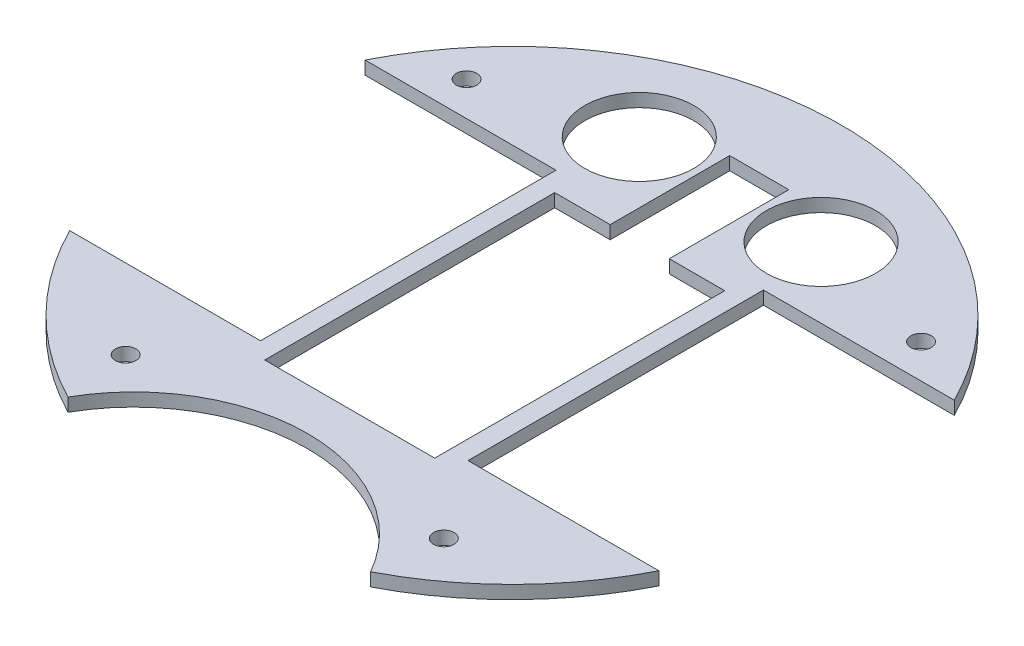
ISO-10303-21;
HEADER;
FILE_DESCRIPTION(('STEP AP214'),'2;1');
FILE_NAME('part.step','',(''),(''),'','','');
FILE_SCHEMA(('AUTOMOTIVE_DESIGN { 1 0 10303 214 1 1 1 1 }'));
ENDSEC;
DATA;
#1=APPLICATION_CONTEXT('core data for automotive mechanical design processes');
#2=APPLICATION_PROTOCOL_DEFINITION('international standard','automotive_design',2000,#1);
#3=PRODUCT_CONTEXT('',#1,'mechanical');
#4=PRODUCT('Part','Part','',(#3));
#5=PRODUCT_RELATED_PRODUCT_CATEGORY('part','',(#4));
#6=PRODUCT_DEFINITION_FORMATION('','',#4);
#7=PRODUCT_DEFINITION_CONTEXT('part definition',#1,'design');
#8=PRODUCT_DEFINITION('design','',#6,#7);
#9=PRODUCT_DEFINITION_SHAPE('','',#8);
#10=(LENGTH_UNIT() NAMED_UNIT(*) SI_UNIT(.MILLI.,.METRE.));
#11=(NAMED_UNIT(*) PLANE_ANGLE_UNIT() SI_UNIT($,.RADIAN.));
#12=(NAMED_UNIT(*) SI_UNIT($,.STERADIAN.) SOLID_ANGLE_UNIT());
#13=UNCERTAINTY_MEASURE_WITH_UNIT(LENGTH_MEASURE(1.E-05),#10,'distance_accuracy_value','');
#14=(GEOMETRIC_REPRESENTATION_CONTEXT(3) GLOBAL_UNCERTAINTY_ASSIGNED_CONTEXT((#13)) GLOBAL_UNIT_ASSIGNED_CONTEXT((#10,
#11,#12)) REPRESENTATION_CONTEXT('',''));
#15=CARTESIAN_POINT('',(0.,0.,0.));
#16=DIRECTION('',(0.,0.,1.));
#17=DIRECTION('',(1.,0.,0.));
#18=AXIS2_PLACEMENT_3D('',#15,#16,#17);
#19=CARTESIAN_POINT('',(18.7,0.,-28.1));
#20=DIRECTION('',(0.,0.,-1.));
#21=DIRECTION('',(-1.,0.,0.));
#22=AXIS2_PLACEMENT_3D('',#19,#20,#21);
#23=PLANE('',#22);
#24=DIRECTION('',(-1.,0.,0.));
#25=VECTOR('',#24,1.);
#26=CARTESIAN_POINT('',(18.7,0.,-28.1));
#27=LINE('',#26,#25);
#28=CARTESIAN_POINT('',(-6.5,0.,-28.1));
#29=VERTEX_POINT('',#28);
#30=CARTESIAN_POINT('',(-18.7,0.,-28.1));
#31=VERTEX_POINT('',#30);
#32=EDGE_CURVE('E174',#29,#31,#27,.T.);
#33=ORIENTED_EDGE('',*,*,#32,.F.);
#34=DIRECTION('',(0.,1.,0.));
#35=VECTOR('',#34,1.);
#36=CARTESIAN_POINT('',(-6.5,0.,-28.1));
#37=LINE('',#36,#35);
#38=CARTESIAN_POINT('',(-6.5,2.9,-28.1));
#39=VERTEX_POINT('',#38);
#40=EDGE_CURVE('E157',#29,#39,#37,.T.);
#41=ORIENTED_EDGE('',*,*,#40,.T.);
#42=DIRECTION('',(-1.,0.,0.));
#43=VECTOR('',#42,1.);
#44=CARTESIAN_POINT('',(18.7,2.9,-28.1));
#45=LINE('',#44,#43);
#46=CARTESIAN_POINT('',(-18.7,2.9,-28.1));
#47=VERTEX_POINT('',#46);
#48=EDGE_CURVE('E201',#39,#47,#45,.T.);
#49=ORIENTED_EDGE('',*,*,#48,.T.);
#50=DIRECTION('',(0.,1.,0.));
#51=VECTOR('',#50,1.);
#52=CARTESIAN_POINT('',(-18.7,0.,-28.1));
#53=LINE('',#52,#51);
#54=EDGE_CURVE('E180',#31,#47,#53,.T.);
#55=ORIENTED_EDGE('',*,*,#54,.F.);
#56=EDGE_LOOP('',(#33,#41,#49,#55));
#57=FACE_BOUND('',#56,.T.);
#58=ADVANCED_FACE('F32',(#57),#23,.F.);
#59=CARTESIAN_POINT('',(0.,2.9,0.));
#60=DIRECTION('',(0.,-1.,0.));
#61=DIRECTION('',(0.,0.,-1.));
#62=AXIS2_PLACEMENT_3D('',#59,#60,#61);
#63=CYLINDRICAL_SURFACE('',#62,72.5);
#64=CARTESIAN_POINT('',(0.,0.,0.));
#65=DIRECTION('',(0.,1.,0.));
#66=DIRECTION('',(0.,0.,1.));
#67=AXIS2_PLACEMENT_3D('',#64,#65,#66);
#68=CIRCLE('',#67,72.5);
#69=CARTESIAN_POINT('',(33.2911053697012,0.,64.4045984636458));
#70=VERTEX_POINT('',#69);
#71=CARTESIAN_POINT('',(64.8074069840786,0.,32.4999999999999));
#72=VERTEX_POINT('',#71);
#73=EDGE_CURVE('E218',#70,#72,#68,.T.);
#74=ORIENTED_EDGE('',*,*,#73,.T.);
#75=DIRECTION('',(0.,1.,0.));
#76=VECTOR('',#75,1.);
#77=CARTESIAN_POINT('',(64.8074069840786,0.,32.4999999999999));
#78=LINE('',#77,#76);
#79=CARTESIAN_POINT('',(64.8074069840786,2.9,32.4999999999999));
#80=VERTEX_POINT('',#79);
#81=EDGE_CURVE('E244',#72,#80,#78,.T.);
#82=ORIENTED_EDGE('',*,*,#81,.T.);
#83=CARTESIAN_POINT('',(0.,2.9,0.));
#84=DIRECTION('',(0.,1.,0.));
#85=DIRECTION('',(0.,0.,1.));
#86=AXIS2_PLACEMENT_3D('',#83,#84,#85);
#87=CIRCLE('',#86,72.5);
#88=CARTESIAN_POINT('',(33.2911053697012,2.9,64.4045984636458));
#89=VERTEX_POINT('',#88);
#90=EDGE_CURVE('E219',#89,#80,#87,.T.);
#91=ORIENTED_EDGE('',*,*,#90,.F.);
#92=DIRECTION('',(0.,-1.,0.));
#93=VECTOR('',#92,1.);
#94=CARTESIAN_POINT('',(33.2911053697012,2.9,64.4045984636458));
#95=LINE('',#94,#93);
#96=EDGE_CURVE('E11',#89,#70,#95,.T.);
#97=ORIENTED_EDGE('',*,*,#96,.T.);
#98=EDGE_LOOP('',(#74,#82,#91,#97));
#99=FACE_BOUND('',#98,.T.);
#100=ADVANCED_FACE('F243',(#99),#63,.T.);
#101=CARTESIAN_POINT('',(64.8074069840786,2.9,-32.5));
#102=VERTEX_POINT('',#101);
#103=CARTESIAN_POINT('',(-64.8074069840786,2.9,-32.5));
#104=VERTEX_POINT('',#103);
#105=EDGE_CURVE('E222',#102,#104,#87,.T.);
#106=ORIENTED_EDGE('',*,*,#105,.F.);
#107=DIRECTION('',(0.,1.,0.));
#108=VECTOR('',#107,1.);
#109=CARTESIAN_POINT('',(64.8074069840786,0.,-32.5));
#110=LINE('',#109,#108);
#111=CARTESIAN_POINT('',(64.8074069840786,0.,-32.5));
#112=VERTEX_POINT('',#111);
#113=EDGE_CURVE('E319',#112,#102,#110,.T.);
#114=ORIENTED_EDGE('',*,*,#113,.F.);
#115=CARTESIAN_POINT('',(-64.8074069840786,0.,-32.5));
#116=VERTEX_POINT('',#115);
#117=EDGE_CURVE('E227',#112,#116,#68,.T.);
#118=ORIENTED_EDGE('',*,*,#117,.T.);
#119=DIRECTION('',(0.,1.,0.));
#120=VECTOR('',#119,1.);
#121=CARTESIAN_POINT('',(-64.8074069840786,0.,-32.5));
#122=LINE('',#121,#120);
#123=EDGE_CURVE('E268',#116,#104,#122,.T.);
#124=ORIENTED_EDGE('',*,*,#123,.T.);
#125=EDGE_LOOP('',(#106,#114,#118,#124));
#126=FACE_BOUND('',#125,.T.);
#127=ADVANCED_FACE('F275',(#126),#63,.T.);
#128=CARTESIAN_POINT('',(0.,2.9,83.2397996376034));
#129=DIRECTION('',(0.,-1.,0.));
#130=DIRECTION('',(0.,0.,-1.));
#131=AXIS2_PLACEMENT_3D('',#128,#129,#130);
#132=CYLINDRICAL_SURFACE('',#131,38.25);
#133=CARTESIAN_POINT('',(0.,0.,83.2397996376034));
#134=DIRECTION('',(0.,-1.,0.));
#135=DIRECTION('',(0.,0.,1.));
#136=AXIS2_PLACEMENT_3D('',#133,#134,#135);
#137=CIRCLE('',#136,38.25);
#138=CARTESIAN_POINT('',(-33.2911053697012,0.,64.4045984636458));
#139=VERTEX_POINT('',#138);
#140=EDGE_CURVE('E207',#139,#70,#137,.T.);
#141=ORIENTED_EDGE('',*,*,#140,.T.);
#142=ORIENTED_EDGE('',*,*,#96,.F.);
#143=CARTESIAN_POINT('',(0.,2.9,83.2397996376034));
#144=DIRECTION('',(0.,-1.,0.));
#145=DIRECTION('',(0.,0.,1.));
#146=AXIS2_PLACEMENT_3D('',#143,#144,#145);
#147=CIRCLE('',#146,38.25);
#148=CARTESIAN_POINT('',(-33.2911053697012,2.9,64.4045984636458));
#149=VERTEX_POINT('',#148);
#150=EDGE_CURVE('E214',#149,#89,#147,.T.);
#151=ORIENTED_EDGE('',*,*,#150,.F.);
#152=DIRECTION('',(0.,-1.,0.));
#153=VECTOR('',#152,1.);
#154=CARTESIAN_POINT('',(-33.2911053697012,2.9,64.4045984636458));
#155=LINE('',#154,#153);
#156=EDGE_CURVE('E40',#149,#139,#155,.T.);
#157=ORIENTED_EDGE('',*,*,#156,.T.);
#158=EDGE_LOOP('',(#141,#142,#151,#157));
#159=FACE_BOUND('',#158,.T.);
#160=ADVANCED_FACE('F34',(#159),#132,.F.);
#161=CARTESIAN_POINT('',(-64.8074069840787,2.9,32.4999999999999));
#162=VERTEX_POINT('',#161);
#163=EDGE_CURVE('E217',#162,#149,#87,.T.);
#164=ORIENTED_EDGE('',*,*,#163,.F.);
#165=DIRECTION('',(0.,1.,0.));
#166=VECTOR('',#165,1.);
#167=CARTESIAN_POINT('',(-64.8074069840787,0.,32.4999999999999));
#168=LINE('',#167,#166);
#169=CARTESIAN_POINT('',(-64.8074069840787,0.,32.4999999999999));
#170=VERTEX_POINT('',#169);
#171=EDGE_CURVE('E195',#170,#162,#168,.T.);
#172=ORIENTED_EDGE('',*,*,#171,.F.);
#173=EDGE_CURVE('E225',#170,#139,#68,.T.);
#174=ORIENTED_EDGE('',*,*,#173,.T.);
#175=ORIENTED_EDGE('',*,*,#156,.F.);
#176=EDGE_LOOP('',(#164,#172,#174,#175));
#177=FACE_BOUND('',#176,.T.);
#178=ADVANCED_FACE('F342',(#177),#63,.T.);
#179=CARTESIAN_POINT('',(0.,2.9,41.6198998188017));
#180=DIRECTION('',(0.,1.,0.));
#181=DIRECTION('',(0.,0.,1.));
#182=AXIS2_PLACEMENT_3D('',#179,#180,#181);
#183=PLANE('',#182);
#184=CARTESIAN_POINT('',(-35.,2.9,50.));
#185=DIRECTION('',(0.,1.,0.));
#186=DIRECTION('',(0.,0.,1.));
#187=AXIS2_PLACEMENT_3D('',#184,#185,#186);
#188=CIRCLE('',#187,2.25);
#189=CARTESIAN_POINT('',(-35.,2.9,52.25));
#190=VERTEX_POINT('',#189);
#191=EDGE_CURVE('E436',#190,#190,#188,.T.);
#192=ORIENTED_EDGE('',*,*,#191,.F.);
#193=EDGE_LOOP('',(#192));
#194=FACE_BOUND('',#193,.T.);
#195=CARTESIAN_POINT('',(-50.,2.9,-40.));
#196=DIRECTION('',(0.,1.,0.));
#197=DIRECTION('',(0.,0.,1.));
#198=AXIS2_PLACEMENT_3D('',#195,#196,#197);
#199=CIRCLE('',#198,2.25);
#200=CARTESIAN_POINT('',(-50.,2.9,-37.75));
#201=VERTEX_POINT('',#200);
#202=EDGE_CURVE('E442',#201,#201,#199,.T.);
#203=ORIENTED_EDGE('',*,*,#202,.F.);
#204=EDGE_LOOP('',(#203));
#205=FACE_BOUND('',#204,.T.);
#206=CARTESIAN_POINT('',(50.,2.9,-40.));
#207=DIRECTION('',(0.,1.,0.));
#208=DIRECTION('',(0.,0.,1.));
#209=AXIS2_PLACEMENT_3D('',#206,#207,#208);
#210=CIRCLE('',#209,2.25);
#211=CARTESIAN_POINT('',(50.,2.9,-37.75));
#212=VERTEX_POINT('',#211);
#213=EDGE_CURVE('E450',#212,#212,#210,.T.);
#214=ORIENTED_EDGE('',*,*,#213,.F.);
#215=EDGE_LOOP('',(#214));
#216=FACE_BOUND('',#215,.T.);
#217=CARTESIAN_POINT('',(35.,2.9,50.));
#218=DIRECTION('',(0.,1.,0.));
#219=DIRECTION('',(0.,0.,1.));
#220=AXIS2_PLACEMENT_3D('',#217,#218,#219);
#221=CIRCLE('',#220,2.25);
#222=CARTESIAN_POINT('',(35.,2.9,52.25));
#223=VERTEX_POINT('',#222);
#224=EDGE_CURVE('E439',#223,#223,#221,.T.);
#225=ORIENTED_EDGE('',*,*,#224,.F.);
#226=EDGE_LOOP('',(#225));
#227=FACE_BOUND('',#226,.T.);
#228=CARTESIAN_POINT('',(20.,2.9,-48.));
#229=DIRECTION('',(0.,1.,0.));
#230=DIRECTION('',(0.,0.,1.));
#231=AXIS2_PLACEMENT_3D('',#228,#229,#230);
#232=CIRCLE('',#231,12.);
#233=CARTESIAN_POINT('',(20.,2.9,-36.));
#234=VERTEX_POINT('',#233);
#235=EDGE_CURVE('E456',#234,#234,#232,.T.);
#236=ORIENTED_EDGE('',*,*,#235,.F.);
#237=EDGE_LOOP('',(#236));
#238=FACE_BOUND('',#237,.T.);
#239=CARTESIAN_POINT('',(-20.,2.9,-48.));
#240=DIRECTION('',(0.,1.,0.));
#241=DIRECTION('',(0.,0.,1.));
#242=AXIS2_PLACEMENT_3D('',#239,#240,#241);
#243=CIRCLE('',#242,12.);
#244=CARTESIAN_POINT('',(-20.,2.9,-36.));
#245=VERTEX_POINT('',#244);
#246=EDGE_CURVE('E462',#245,#245,#243,.T.);
#247=ORIENTED_EDGE('',*,*,#246,.F.);
#248=EDGE_LOOP('',(#247));
#249=FACE_BOUND('',#248,.T.);
#250=DIRECTION('',(0.,0.,1.));
#251=VECTOR('',#250,1.);
#252=CARTESIAN_POINT('',(-6.5,2.9,-28.1));
#253=LINE('',#252,#251);
#254=CARTESIAN_POINT('',(-6.5,2.9,-54.4));
#255=VERTEX_POINT('',#254);
#256=EDGE_CURVE('E163',#255,#39,#253,.T.);
#257=ORIENTED_EDGE('',*,*,#256,.F.);
#258=DIRECTION('',(-1.,0.,0.));
#259=VECTOR('',#258,1.);
#260=CARTESIAN_POINT('',(6.5,2.9,-54.4));
#261=LINE('',#260,#259);
#262=CARTESIAN_POINT('',(6.5,2.9,-54.4));
#263=VERTEX_POINT('',#262);
#264=EDGE_CURVE('E177',#263,#255,#261,.T.);
#265=ORIENTED_EDGE('',*,*,#264,.F.);
#266=DIRECTION('',(0.,0.,-1.));
#267=VECTOR('',#266,1.);
#268=CARTESIAN_POINT('',(6.5,2.9,-28.1));
#269=LINE('',#268,#267);
#270=CARTESIAN_POINT('',(6.5,2.9,-28.1));
#271=VERTEX_POINT('',#270);
#272=EDGE_CURVE('E302',#271,#263,#269,.T.);
#273=ORIENTED_EDGE('',*,*,#272,.F.);
#274=CARTESIAN_POINT('',(18.7,2.9,-28.1));
#275=VERTEX_POINT('',#274);
#276=EDGE_CURVE('E202',#275,#271,#45,.T.);
#277=ORIENTED_EDGE('',*,*,#276,.F.);
#278=DIRECTION('',(0.,0.,-1.));
#279=VECTOR('',#278,1.);
#280=CARTESIAN_POINT('',(18.7,2.9,35.7));
#281=LINE('',#280,#279);
#282=CARTESIAN_POINT('',(18.7,2.9,35.7));
#283=VERTEX_POINT('',#282);
#284=EDGE_CURVE('E198',#283,#275,#281,.T.);
#285=ORIENTED_EDGE('',*,*,#284,.F.);
#286=DIRECTION('',(1.,0.,0.));
#287=VECTOR('',#286,1.);
#288=CARTESIAN_POINT('',(-18.7,2.9,35.7));
#289=LINE('',#288,#287);
#290=CARTESIAN_POINT('',(-18.7,2.9,35.7));
#291=VERTEX_POINT('',#290);
#292=EDGE_CURVE('E194',#291,#283,#289,.T.);
#293=ORIENTED_EDGE('',*,*,#292,.F.);
#294=DIRECTION('',(0.,0.,1.));
#295=VECTOR('',#294,1.);
#296=CARTESIAN_POINT('',(-18.7,2.9,-28.1));
#297=LINE('',#296,#295);
#298=EDGE_CURVE('E192',#47,#291,#297,.T.);
#299=ORIENTED_EDGE('',*,*,#298,.F.);
#300=ORIENTED_EDGE('',*,*,#48,.F.);
#301=EDGE_LOOP('',(#257,#265,#273,#277,#285,#293,#299,#300));
#302=FACE_BOUND('',#301,.T.);
#303=DIRECTION('',(1.,0.,0.));
#304=VECTOR('',#303,1.);
#305=CARTESIAN_POINT('',(34.6299999999999,2.9,32.5));
#306=LINE('',#305,#304);
#307=CARTESIAN_POINT('',(22.8299999999999,2.9,32.4999999999999));
#308=VERTEX_POINT('',#307);
#309=EDGE_CURVE('E316',#308,#80,#306,.T.);
#310=ORIENTED_EDGE('',*,*,#309,.F.);
#311=DIRECTION('',(0.,0.,1.));
#312=VECTOR('',#311,1.);
#313=CARTESIAN_POINT('',(22.8299999999999,2.9,-32.5));
#314=LINE('',#313,#312);
#315=CARTESIAN_POINT('',(22.8299999999999,2.9,-32.5));
#316=VERTEX_POINT('',#315);
#317=EDGE_CURVE('E321',#316,#308,#314,.T.);
#318=ORIENTED_EDGE('',*,*,#317,.F.);
#319=DIRECTION('',(-1.,0.,0.));
#320=VECTOR('',#319,1.);
#321=CARTESIAN_POINT('',(64.8074069840786,2.9,-32.5));
#322=LINE('',#321,#320);
#323=EDGE_CURVE('E260',#102,#316,#322,.T.);
#324=ORIENTED_EDGE('',*,*,#323,.F.);
#325=ORIENTED_EDGE('',*,*,#105,.T.);
#326=DIRECTION('',(-1.,0.,0.));
#327=VECTOR('',#326,1.);
#328=CARTESIAN_POINT('',(-22.8299999999999,2.9,-32.5));
#329=LINE('',#328,#327);
#330=CARTESIAN_POINT('',(-22.8299999999999,2.9,-32.5));
#331=VERTEX_POINT('',#330);
#332=EDGE_CURVE('E257',#331,#104,#329,.T.);
#333=ORIENTED_EDGE('',*,*,#332,.F.);
#334=DIRECTION('',(0.,0.,-1.));
#335=VECTOR('',#334,1.);
#336=CARTESIAN_POINT('',(-22.8299999999999,2.9,32.4999999999999));
#337=LINE('',#336,#335);
#338=CARTESIAN_POINT('',(-22.8299999999999,2.9,32.4999999999999));
#339=VERTEX_POINT('',#338);
#340=EDGE_CURVE('E273',#339,#331,#337,.T.);
#341=ORIENTED_EDGE('',*,*,#340,.F.);
#342=DIRECTION('',(1.,0.,0.));
#343=VECTOR('',#342,1.);
#344=CARTESIAN_POINT('',(-34.6299999999999,2.9,32.5));
#345=LINE('',#344,#343);
#346=EDGE_CURVE('E251',#162,#339,#345,.T.);
#347=ORIENTED_EDGE('',*,*,#346,.F.);
#348=ORIENTED_EDGE('',*,*,#163,.T.);
#349=ORIENTED_EDGE('',*,*,#150,.T.);
#350=ORIENTED_EDGE('',*,*,#90,.T.);
#351=EDGE_LOOP('',(#310,#318,#324,#325,#333,#341,#347,#348,#349,#350));
#352=FACE_BOUND('',#351,.T.);
#353=ADVANCED_FACE('F247',(#194,#205,#216,#227,#238,#249,#302,#352),#183,.T.);
#354=CARTESIAN_POINT('',(0.,0.,41.6198998188017));
#355=DIRECTION('',(0.,1.,0.));
#356=DIRECTION('',(0.,0.,1.));
#357=AXIS2_PLACEMENT_3D('',#354,#355,#356);
#358=PLANE('',#357);
#359=CARTESIAN_POINT('',(-35.,0.,50.));
#360=DIRECTION('',(0.,1.,0.));
#361=DIRECTION('',(0.,0.,1.));
#362=AXIS2_PLACEMENT_3D('',#359,#360,#361);
#363=CIRCLE('',#362,2.25);
#364=CARTESIAN_POINT('',(-35.,0.,52.25));
#365=VERTEX_POINT('',#364);
#366=EDGE_CURVE('E433',#365,#365,#363,.T.);
#367=ORIENTED_EDGE('',*,*,#366,.T.);
#368=EDGE_LOOP('',(#367));
#369=FACE_BOUND('',#368,.T.);
#370=CARTESIAN_POINT('',(-50.,0.,-40.));
#371=DIRECTION('',(0.,1.,0.));
#372=DIRECTION('',(0.,0.,1.));
#373=AXIS2_PLACEMENT_3D('',#370,#371,#372);
#374=CIRCLE('',#373,2.25);
#375=CARTESIAN_POINT('',(-50.,0.,-37.75));
#376=VERTEX_POINT('',#375);
#377=EDGE_CURVE('E437',#376,#376,#374,.T.);
#378=ORIENTED_EDGE('',*,*,#377,.T.);
#379=EDGE_LOOP('',(#378));
#380=FACE_BOUND('',#379,.T.);
#381=CARTESIAN_POINT('',(50.,0.,-40.));
#382=DIRECTION('',(0.,1.,0.));
#383=DIRECTION('',(0.,0.,1.));
#384=AXIS2_PLACEMENT_3D('',#381,#382,#383);
#385=CIRCLE('',#384,2.25);
#386=CARTESIAN_POINT('',(50.,0.,-37.75));
#387=VERTEX_POINT('',#386);
#388=EDGE_CURVE('E447',#387,#387,#385,.T.);
#389=ORIENTED_EDGE('',*,*,#388,.T.);
#390=EDGE_LOOP('',(#389));
#391=FACE_BOUND('',#390,.T.);
#392=CARTESIAN_POINT('',(35.,0.,50.));
#393=DIRECTION('',(0.,1.,0.));
#394=DIRECTION('',(0.,0.,1.));
#395=AXIS2_PLACEMENT_3D('',#392,#393,#394);
#396=CIRCLE('',#395,2.25);
#397=CARTESIAN_POINT('',(35.,0.,52.25));
#398=VERTEX_POINT('',#397);
#399=EDGE_CURVE('E453',#398,#398,#396,.T.);
#400=ORIENTED_EDGE('',*,*,#399,.T.);
#401=EDGE_LOOP('',(#400));
#402=FACE_BOUND('',#401,.T.);
#403=CARTESIAN_POINT('',(20.,0.,-48.));
#404=DIRECTION('',(0.,1.,0.));
#405=DIRECTION('',(0.,0.,1.));
#406=AXIS2_PLACEMENT_3D('',#403,#404,#405);
#407=CIRCLE('',#406,12.);
#408=CARTESIAN_POINT('',(20.,0.,-36.));
#409=VERTEX_POINT('',#408);
#410=EDGE_CURVE('E459',#409,#409,#407,.T.);
#411=ORIENTED_EDGE('',*,*,#410,.T.);
#412=EDGE_LOOP('',(#411));
#413=FACE_BOUND('',#412,.T.);
#414=CARTESIAN_POINT('',(-20.,0.,-48.));
#415=DIRECTION('',(0.,1.,0.));
#416=DIRECTION('',(0.,0.,1.));
#417=AXIS2_PLACEMENT_3D('',#414,#415,#416);
#418=CIRCLE('',#417,12.);
#419=CARTESIAN_POINT('',(-20.,0.,-36.));
#420=VERTEX_POINT('',#419);
#421=EDGE_CURVE('E303',#420,#420,#418,.T.);
#422=ORIENTED_EDGE('',*,*,#421,.T.);
#423=EDGE_LOOP('',(#422));
#424=FACE_BOUND('',#423,.T.);
#425=DIRECTION('',(-1.,0.,0.));
#426=VECTOR('',#425,1.);
#427=CARTESIAN_POINT('',(6.5,0.,-54.4));
#428=LINE('',#427,#426);
#429=CARTESIAN_POINT('',(6.5,0.,-54.4));
#430=VERTEX_POINT('',#429);
#431=CARTESIAN_POINT('',(-6.5,0.,-54.4));
#432=VERTEX_POINT('',#431);
#433=EDGE_CURVE('E168',#430,#432,#428,.T.);
#434=ORIENTED_EDGE('',*,*,#433,.T.);
#435=DIRECTION('',(0.,0.,1.));
#436=VECTOR('',#435,1.);
#437=CARTESIAN_POINT('',(-6.5,0.,-28.1));
#438=LINE('',#437,#436);
#439=EDGE_CURVE('E160',#432,#29,#438,.T.);
#440=ORIENTED_EDGE('',*,*,#439,.T.);
#441=ORIENTED_EDGE('',*,*,#32,.T.);
#442=DIRECTION('',(0.,0.,1.));
#443=VECTOR('',#442,1.);
#444=CARTESIAN_POINT('',(-18.7,0.,-28.1));
#445=LINE('',#444,#443);
#446=CARTESIAN_POINT('',(-18.7,0.,35.7));
#447=VERTEX_POINT('',#446);
#448=EDGE_CURVE('E205',#31,#447,#445,.T.);
#449=ORIENTED_EDGE('',*,*,#448,.T.);
#450=DIRECTION('',(1.,0.,0.));
#451=VECTOR('',#450,1.);
#452=CARTESIAN_POINT('',(-18.7,0.,35.7));
#453=LINE('',#452,#451);
#454=CARTESIAN_POINT('',(18.7,0.,35.7));
#455=VERTEX_POINT('',#454);
#456=EDGE_CURVE('E188',#447,#455,#453,.T.);
#457=ORIENTED_EDGE('',*,*,#456,.T.);
#458=DIRECTION('',(0.,0.,-1.));
#459=VECTOR('',#458,1.);
#460=CARTESIAN_POINT('',(18.7,0.,35.7));
#461=LINE('',#460,#459);
#462=CARTESIAN_POINT('',(18.7,0.,-28.1));
#463=VERTEX_POINT('',#462);
#464=EDGE_CURVE('E183',#455,#463,#461,.T.);
#465=ORIENTED_EDGE('',*,*,#464,.T.);
#466=CARTESIAN_POINT('',(6.5,0.,-28.1));
#467=VERTEX_POINT('',#466);
#468=EDGE_CURVE('E182',#463,#467,#27,.T.);
#469=ORIENTED_EDGE('',*,*,#468,.T.);
#470=DIRECTION('',(0.,0.,-1.));
#471=VECTOR('',#470,1.);
#472=CARTESIAN_POINT('',(6.5,0.,-28.1));
#473=LINE('',#472,#471);
#474=EDGE_CURVE('E47',#467,#430,#473,.T.);
#475=ORIENTED_EDGE('',*,*,#474,.T.);
#476=EDGE_LOOP('',(#434,#440,#441,#449,#457,#465,#469,#475));
#477=FACE_BOUND('',#476,.T.);
#478=DIRECTION('',(0.,0.,1.));
#479=VECTOR('',#478,1.);
#480=CARTESIAN_POINT('',(22.8299999999999,0.,-32.5));
#481=LINE('',#480,#479);
#482=CARTESIAN_POINT('',(22.8299999999999,0.,-32.5));
#483=VERTEX_POINT('',#482);
#484=CARTESIAN_POINT('',(22.8299999999999,0.,32.4999999999999));
#485=VERTEX_POINT('',#484);
#486=EDGE_CURVE('E55',#483,#485,#481,.T.);
#487=ORIENTED_EDGE('',*,*,#486,.T.);
#488=DIRECTION('',(1.,0.,0.));
#489=VECTOR('',#488,1.);
#490=CARTESIAN_POINT('',(22.8299999999999,0.,32.4999999999999));
#491=LINE('',#490,#489);
#492=EDGE_CURVE('E240',#485,#72,#491,.T.);
#493=ORIENTED_EDGE('',*,*,#492,.T.);
#494=ORIENTED_EDGE('',*,*,#73,.F.);
#495=ORIENTED_EDGE('',*,*,#140,.F.);
#496=ORIENTED_EDGE('',*,*,#173,.F.);
#497=DIRECTION('',(1.,0.,0.));
#498=VECTOR('',#497,1.);
#499=CARTESIAN_POINT('',(-64.8074069840786,0.,32.4999999999999));
#500=LINE('',#499,#498);
#501=CARTESIAN_POINT('',(-22.8299999999999,0.,32.4999999999999));
#502=VERTEX_POINT('',#501);
#503=EDGE_CURVE('E272',#170,#502,#500,.T.);
#504=ORIENTED_EDGE('',*,*,#503,.T.);
#505=DIRECTION('',(0.,0.,-1.));
#506=VECTOR('',#505,1.);
#507=CARTESIAN_POINT('',(-22.8299999999999,0.,32.4999999999999));
#508=LINE('',#507,#506);
#509=CARTESIAN_POINT('',(-22.8299999999999,0.,-32.5));
#510=VERTEX_POINT('',#509);
#511=EDGE_CURVE('E332',#502,#510,#508,.T.);
#512=ORIENTED_EDGE('',*,*,#511,.T.);
#513=DIRECTION('',(-1.,0.,0.));
#514=VECTOR('',#513,1.);
#515=CARTESIAN_POINT('',(-22.8299999999999,0.,-32.5));
#516=LINE('',#515,#514);
#517=EDGE_CURVE('E283',#510,#116,#516,.T.);
#518=ORIENTED_EDGE('',*,*,#517,.T.);
#519=ORIENTED_EDGE('',*,*,#117,.F.);
#520=DIRECTION('',(-1.,0.,0.));
#521=VECTOR('',#520,1.);
#522=CARTESIAN_POINT('',(64.8074069840786,0.,-32.5));
#523=LINE('',#522,#521);
#524=EDGE_CURVE('E313',#112,#483,#523,.T.);
#525=ORIENTED_EDGE('',*,*,#524,.T.);
#526=EDGE_LOOP('',(#487,#493,#494,#495,#496,#504,#512,#518,#519,#525));
#527=FACE_BOUND('',#526,.T.);
#528=ADVANCED_FACE('F171',(#369,#380,#391,#402,#413,#424,#477,#527),#358,.F.);
#529=CARTESIAN_POINT('',(-18.7,0.,-28.1));
#530=DIRECTION('',(-1.,0.,0.));
#531=DIRECTION('',(0.,0.,1.));
#532=AXIS2_PLACEMENT_3D('',#529,#530,#531);
#533=PLANE('',#532);
#534=ORIENTED_EDGE('',*,*,#298,.T.);
#535=DIRECTION('',(0.,1.,0.));
#536=VECTOR('',#535,1.);
#537=CARTESIAN_POINT('',(-18.7,0.,35.7));
#538=LINE('',#537,#536);
#539=EDGE_CURVE('E186',#447,#291,#538,.T.);
#540=ORIENTED_EDGE('',*,*,#539,.F.);
#541=ORIENTED_EDGE('',*,*,#448,.F.);
#542=ORIENTED_EDGE('',*,*,#54,.T.);
#543=EDGE_LOOP('',(#534,#540,#541,#542));
#544=FACE_BOUND('',#543,.T.);
#545=ADVANCED_FACE('F360',(#544),#533,.F.);
#546=ORIENTED_EDGE('',*,*,#276,.T.);
#547=DIRECTION('',(0.,1.,0.));
#548=VECTOR('',#547,1.);
#549=CARTESIAN_POINT('',(6.5,0.,-28.1));
#550=LINE('',#549,#548);
#551=EDGE_CURVE('E167',#467,#271,#550,.T.);
#552=ORIENTED_EDGE('',*,*,#551,.F.);
#553=ORIENTED_EDGE('',*,*,#468,.F.);
#554=DIRECTION('',(0.,1.,0.));
#555=VECTOR('',#554,1.);
#556=CARTESIAN_POINT('',(18.7,0.,-28.1));
#557=LINE('',#556,#555);
#558=EDGE_CURVE('E208',#463,#275,#557,.T.);
#559=ORIENTED_EDGE('',*,*,#558,.T.);
#560=EDGE_LOOP('',(#546,#552,#553,#559));
#561=FACE_BOUND('',#560,.T.);
#562=ADVANCED_FACE('F296',(#561),#23,.F.);
#563=CARTESIAN_POINT('',(18.7,0.,35.7));
#564=DIRECTION('',(1.,0.,0.));
#565=DIRECTION('',(0.,0.,-1.));
#566=AXIS2_PLACEMENT_3D('',#563,#564,#565);
#567=PLANE('',#566);
#568=ORIENTED_EDGE('',*,*,#284,.T.);
#569=ORIENTED_EDGE('',*,*,#558,.F.);
#570=ORIENTED_EDGE('',*,*,#464,.F.);
#571=DIRECTION('',(0.,1.,0.));
#572=VECTOR('',#571,1.);
#573=CARTESIAN_POINT('',(18.7,0.,35.7));
#574=LINE('',#573,#572);
#575=EDGE_CURVE('E210',#455,#283,#574,.T.);
#576=ORIENTED_EDGE('',*,*,#575,.T.);
#577=EDGE_LOOP('',(#568,#569,#570,#576));
#578=FACE_BOUND('',#577,.T.);
#579=ADVANCED_FACE('F292',(#578),#567,.F.);
#580=CARTESIAN_POINT('',(-18.7,0.,35.7));
#581=DIRECTION('',(0.,0.,1.));
#582=DIRECTION('',(1.,0.,0.));
#583=AXIS2_PLACEMENT_3D('',#580,#581,#582);
#584=PLANE('',#583);
#585=ORIENTED_EDGE('',*,*,#292,.T.);
#586=ORIENTED_EDGE('',*,*,#575,.F.);
#587=ORIENTED_EDGE('',*,*,#456,.F.);
#588=ORIENTED_EDGE('',*,*,#539,.T.);
#589=EDGE_LOOP('',(#585,#586,#587,#588));
#590=FACE_BOUND('',#589,.T.);
#591=ADVANCED_FACE('F288',(#590),#584,.F.);
#592=CARTESIAN_POINT('',(-22.8299999999999,0.,-32.5));
#593=DIRECTION('',(0.,0.,-1.));
#594=DIRECTION('',(-1.,0.,0.));
#595=AXIS2_PLACEMENT_3D('',#592,#593,#594);
#596=PLANE('',#595);
#597=ORIENTED_EDGE('',*,*,#332,.T.);
#598=ORIENTED_EDGE('',*,*,#123,.F.);
#599=ORIENTED_EDGE('',*,*,#517,.F.);
#600=DIRECTION('',(0.,1.,0.));
#601=VECTOR('',#600,1.);
#602=CARTESIAN_POINT('',(-22.8299999999999,0.,-32.5));
#603=LINE('',#602,#601);
#604=EDGE_CURVE('E270',#510,#331,#603,.T.);
#605=ORIENTED_EDGE('',*,*,#604,.T.);
#606=EDGE_LOOP('',(#597,#598,#599,#605));
#607=FACE_BOUND('',#606,.T.);
#608=ADVANCED_FACE('F266',(#607),#596,.F.);
#609=CARTESIAN_POINT('',(-22.8299999999999,0.,32.4999999999999));
#610=DIRECTION('',(1.,0.,0.));
#611=DIRECTION('',(0.,0.,-1.));
#612=AXIS2_PLACEMENT_3D('',#609,#610,#611);
#613=PLANE('',#612);
#614=ORIENTED_EDGE('',*,*,#340,.T.);
#615=ORIENTED_EDGE('',*,*,#604,.F.);
#616=ORIENTED_EDGE('',*,*,#511,.F.);
#617=DIRECTION('',(0.,1.,0.));
#618=VECTOR('',#617,1.);
#619=CARTESIAN_POINT('',(-22.8299999999999,0.,32.4999999999999));
#620=LINE('',#619,#618);
#621=EDGE_CURVE('E279',#502,#339,#620,.T.);
#622=ORIENTED_EDGE('',*,*,#621,.T.);
#623=EDGE_LOOP('',(#614,#615,#616,#622));
#624=FACE_BOUND('',#623,.T.);
#625=ADVANCED_FACE('F338',(#624),#613,.F.);
#626=CARTESIAN_POINT('',(-34.6299999999999,0.,32.5));
#627=DIRECTION('',(0.,0.,1.));
#628=DIRECTION('',(1.,0.,0.));
#629=AXIS2_PLACEMENT_3D('',#626,#627,#628);
#630=PLANE('',#629);
#631=ORIENTED_EDGE('',*,*,#346,.T.);
#632=ORIENTED_EDGE('',*,*,#621,.F.);
#633=ORIENTED_EDGE('',*,*,#503,.F.);
#634=ORIENTED_EDGE('',*,*,#171,.T.);
#635=EDGE_LOOP('',(#631,#632,#633,#634));
#636=FACE_BOUND('',#635,.T.);
#637=ADVANCED_FACE('F341',(#636),#630,.F.);
#638=CARTESIAN_POINT('',(34.6299999999999,0.,32.5));
#639=DIRECTION('',(0.,0.,1.));
#640=DIRECTION('',(1.,0.,0.));
#641=AXIS2_PLACEMENT_3D('',#638,#639,#640);
#642=PLANE('',#641);
#643=ORIENTED_EDGE('',*,*,#309,.T.);
#644=ORIENTED_EDGE('',*,*,#81,.F.);
#645=ORIENTED_EDGE('',*,*,#492,.F.);
#646=DIRECTION('',(0.,1.,0.));
#647=VECTOR('',#646,1.);
#648=CARTESIAN_POINT('',(22.8299999999999,0.,32.4999999999999));
#649=LINE('',#648,#647);
#650=EDGE_CURVE('E326',#485,#308,#649,.T.);
#651=ORIENTED_EDGE('',*,*,#650,.T.);
#652=EDGE_LOOP('',(#643,#644,#645,#651));
#653=FACE_BOUND('',#652,.T.);
#654=ADVANCED_FACE('F385',(#653),#642,.F.);
#655=CARTESIAN_POINT('',(22.8299999999999,0.,-32.5));
#656=DIRECTION('',(-1.,0.,0.));
#657=DIRECTION('',(0.,0.,1.));
#658=AXIS2_PLACEMENT_3D('',#655,#656,#657);
#659=PLANE('',#658);
#660=ORIENTED_EDGE('',*,*,#317,.T.);
#661=ORIENTED_EDGE('',*,*,#650,.F.);
#662=ORIENTED_EDGE('',*,*,#486,.F.);
#663=DIRECTION('',(0.,1.,0.));
#664=VECTOR('',#663,1.);
#665=CARTESIAN_POINT('',(22.8299999999999,0.,-32.5));
#666=LINE('',#665,#664);
#667=EDGE_CURVE('E328',#483,#316,#666,.T.);
#668=ORIENTED_EDGE('',*,*,#667,.T.);
#669=EDGE_LOOP('',(#660,#661,#662,#668));
#670=FACE_BOUND('',#669,.T.);
#671=ADVANCED_FACE('F389',(#670),#659,.F.);
#672=CARTESIAN_POINT('',(64.8074069840786,0.,-32.5));
#673=DIRECTION('',(0.,0.,-1.));
#674=DIRECTION('',(-1.,0.,0.));
#675=AXIS2_PLACEMENT_3D('',#672,#673,#674);
#676=PLANE('',#675);
#677=ORIENTED_EDGE('',*,*,#323,.T.);
#678=ORIENTED_EDGE('',*,*,#667,.F.);
#679=ORIENTED_EDGE('',*,*,#524,.F.);
#680=ORIENTED_EDGE('',*,*,#113,.T.);
#681=EDGE_LOOP('',(#677,#678,#679,#680));
#682=FACE_BOUND('',#681,.T.);
#683=ADVANCED_FACE('F382',(#682),#676,.F.);
#684=CARTESIAN_POINT('',(-6.5,0.,-28.1));
#685=DIRECTION('',(-1.,0.,0.));
#686=DIRECTION('',(0.,0.,1.));
#687=AXIS2_PLACEMENT_3D('',#684,#685,#686);
#688=PLANE('',#687);
#689=ORIENTED_EDGE('',*,*,#256,.T.);
#690=ORIENTED_EDGE('',*,*,#40,.F.);
#691=ORIENTED_EDGE('',*,*,#439,.F.);
#692=DIRECTION('',(0.,1.,0.));
#693=VECTOR('',#692,1.);
#694=CARTESIAN_POINT('',(-6.5,0.,-54.4));
#695=LINE('',#694,#693);
#696=EDGE_CURVE('E308',#432,#255,#695,.T.);
#697=ORIENTED_EDGE('',*,*,#696,.T.);
#698=EDGE_LOOP('',(#689,#690,#691,#697));
#699=FACE_BOUND('',#698,.T.);
#700=ADVANCED_FACE('F159',(#699),#688,.F.);
#701=CARTESIAN_POINT('',(6.5,0.,-54.4));
#702=DIRECTION('',(0.,0.,-1.));
#703=DIRECTION('',(-1.,0.,0.));
#704=AXIS2_PLACEMENT_3D('',#701,#702,#703);
#705=PLANE('',#704);
#706=ORIENTED_EDGE('',*,*,#264,.T.);
#707=ORIENTED_EDGE('',*,*,#696,.F.);
#708=ORIENTED_EDGE('',*,*,#433,.F.);
#709=DIRECTION('',(0.,1.,0.));
#710=VECTOR('',#709,1.);
#711=CARTESIAN_POINT('',(6.5,0.,-54.4));
#712=LINE('',#711,#710);
#713=EDGE_CURVE('E310',#430,#263,#712,.T.);
#714=ORIENTED_EDGE('',*,*,#713,.T.);
#715=EDGE_LOOP('',(#706,#707,#708,#714));
#716=FACE_BOUND('',#715,.T.);
#717=ADVANCED_FACE('F398',(#716),#705,.F.);
#718=CARTESIAN_POINT('',(6.5,0.,-28.1));
#719=DIRECTION('',(1.,0.,0.));
#720=DIRECTION('',(0.,0.,-1.));
#721=AXIS2_PLACEMENT_3D('',#718,#719,#720);
#722=PLANE('',#721);
#723=ORIENTED_EDGE('',*,*,#272,.T.);
#724=ORIENTED_EDGE('',*,*,#713,.F.);
#725=ORIENTED_EDGE('',*,*,#474,.F.);
#726=ORIENTED_EDGE('',*,*,#551,.T.);
#727=EDGE_LOOP('',(#723,#724,#725,#726));
#728=FACE_BOUND('',#727,.T.);
#729=ADVANCED_FACE('F399',(#728),#722,.F.);
#730=CARTESIAN_POINT('',(-20.,0.,-48.));
#731=DIRECTION('',(0.,1.,0.));
#732=DIRECTION('',(0.,0.,1.));
#733=AXIS2_PLACEMENT_3D('',#730,#731,#732);
#734=CYLINDRICAL_SURFACE('',#733,12.);
#735=ORIENTED_EDGE('',*,*,#421,.F.);
#736=EDGE_LOOP('',(#735));
#737=FACE_BOUND('',#736,.T.);
#738=ORIENTED_EDGE('',*,*,#246,.T.);
#739=EDGE_LOOP('',(#738));
#740=FACE_BOUND('',#739,.T.);
#741=ADVANCED_FACE('F402',(#737,#740),#734,.F.);
#742=CARTESIAN_POINT('',(20.,0.,-48.));
#743=DIRECTION('',(0.,1.,0.));
#744=DIRECTION('',(0.,0.,1.));
#745=AXIS2_PLACEMENT_3D('',#742,#743,#744);
#746=CYLINDRICAL_SURFACE('',#745,12.);
#747=ORIENTED_EDGE('',*,*,#410,.F.);
#748=EDGE_LOOP('',(#747));
#749=FACE_BOUND('',#748,.T.);
#750=ORIENTED_EDGE('',*,*,#235,.T.);
#751=EDGE_LOOP('',(#750));
#752=FACE_BOUND('',#751,.T.);
#753=ADVANCED_FACE('F408',(#749,#752),#746,.F.);
#754=CARTESIAN_POINT('',(35.,0.,50.));
#755=DIRECTION('',(0.,1.,0.));
#756=DIRECTION('',(0.,0.,1.));
#757=AXIS2_PLACEMENT_3D('',#754,#755,#756);
#758=CYLINDRICAL_SURFACE('',#757,2.25);
#759=ORIENTED_EDGE('',*,*,#399,.F.);
#760=EDGE_LOOP('',(#759));
#761=FACE_BOUND('',#760,.T.);
#762=ORIENTED_EDGE('',*,*,#224,.T.);
#763=EDGE_LOOP('',(#762));
#764=FACE_BOUND('',#763,.T.);
#765=ADVANCED_FACE('F412',(#761,#764),#758,.F.);
#766=CARTESIAN_POINT('',(50.,0.,-40.));
#767=DIRECTION('',(0.,1.,0.));
#768=DIRECTION('',(0.,0.,1.));
#769=AXIS2_PLACEMENT_3D('',#766,#767,#768);
#770=CYLINDRICAL_SURFACE('',#769,2.25);
#771=ORIENTED_EDGE('',*,*,#388,.F.);
#772=EDGE_LOOP('',(#771));
#773=FACE_BOUND('',#772,.T.);
#774=ORIENTED_EDGE('',*,*,#213,.T.);
#775=EDGE_LOOP('',(#774));
#776=FACE_BOUND('',#775,.T.);
#777=ADVANCED_FACE('F416',(#773,#776),#770,.F.);
#778=CARTESIAN_POINT('',(-50.,0.,-40.));
#779=DIRECTION('',(0.,1.,0.));
#780=DIRECTION('',(0.,0.,1.));
#781=AXIS2_PLACEMENT_3D('',#778,#779,#780);
#782=CYLINDRICAL_SURFACE('',#781,2.25);
#783=ORIENTED_EDGE('',*,*,#377,.F.);
#784=EDGE_LOOP('',(#783));
#785=FACE_BOUND('',#784,.T.);
#786=ORIENTED_EDGE('',*,*,#202,.T.);
#787=EDGE_LOOP('',(#786));
#788=FACE_BOUND('',#787,.T.);
#789=ADVANCED_FACE('F420',(#785,#788),#782,.F.);
#790=CARTESIAN_POINT('',(-35.,0.,50.));
#791=DIRECTION('',(0.,1.,0.));
#792=DIRECTION('',(0.,0.,1.));
#793=AXIS2_PLACEMENT_3D('',#790,#791,#792);
#794=CYLINDRICAL_SURFACE('',#793,2.25);
#795=ORIENTED_EDGE('',*,*,#366,.F.);
#796=EDGE_LOOP('',(#795));
#797=FACE_BOUND('',#796,.T.);
#798=ORIENTED_EDGE('',*,*,#191,.T.);
#799=EDGE_LOOP('',(#798));
#800=FACE_BOUND('',#799,.T.);
#801=ADVANCED_FACE('F424',(#797,#800),#794,.F.);
#802=CLOSED_SHELL('',(#58,#100,#127,#160,#178,#353,#528,#545,#562,#579,#591,#608,#625,#637,#654,
#671,#683,#700,#717,#729,#741,#753,#765,#777,#789,#801));
#803=MANIFOLD_SOLID_BREP('B2',#802);
#804=ADVANCED_BREP_SHAPE_REPRESENTATION('',(#18,#803),#14);
#805=SHAPE_DEFINITION_REPRESENTATION(#9,#804);
ENDSEC;
END-ISO-10303-21;
